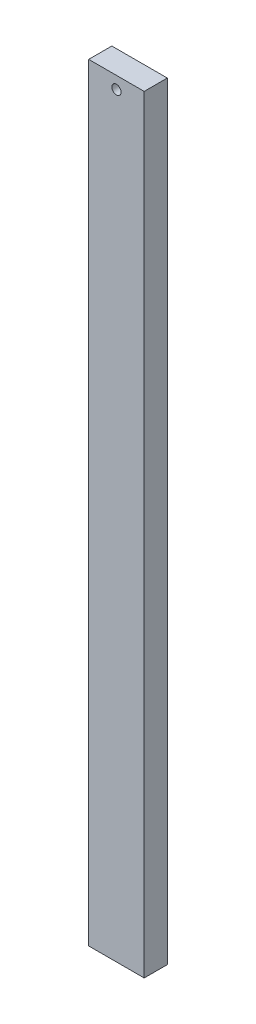
ISO-10303-21;
HEADER;
FILE_DESCRIPTION(('STEP AP214'),'2;1');
FILE_NAME('part.step','',(''),(''),'','','');
FILE_SCHEMA(('AUTOMOTIVE_DESIGN { 1 0 10303 214 1 1 1 1 }'));
ENDSEC;
DATA;
#1=APPLICATION_CONTEXT('core data for automotive mechanical design processes');
#2=APPLICATION_PROTOCOL_DEFINITION('international standard','automotive_design',2000,#1);
#3=PRODUCT_CONTEXT('',#1,'mechanical');
#4=PRODUCT('Part','Part','',(#3));
#5=PRODUCT_RELATED_PRODUCT_CATEGORY('part','',(#4));
#6=PRODUCT_DEFINITION_FORMATION('','',#4);
#7=PRODUCT_DEFINITION_CONTEXT('part definition',#1,'design');
#8=PRODUCT_DEFINITION('design','',#6,#7);
#9=PRODUCT_DEFINITION_SHAPE('','',#8);
#10=(LENGTH_UNIT() NAMED_UNIT(*) SI_UNIT(.MILLI.,.METRE.));
#11=(NAMED_UNIT(*) PLANE_ANGLE_UNIT() SI_UNIT($,.RADIAN.));
#12=(NAMED_UNIT(*) SI_UNIT($,.STERADIAN.) SOLID_ANGLE_UNIT());
#13=UNCERTAINTY_MEASURE_WITH_UNIT(LENGTH_MEASURE(1.E-05),#10,'distance_accuracy_value','');
#14=(GEOMETRIC_REPRESENTATION_CONTEXT(3) GLOBAL_UNCERTAINTY_ASSIGNED_CONTEXT((#13)) GLOBAL_UNIT_ASSIGNED_CONTEXT((#10,
#11,#12)) REPRESENTATION_CONTEXT('',''));
#15=CARTESIAN_POINT('',(0.,0.,0.));
#16=DIRECTION('',(0.,0.,1.));
#17=DIRECTION('',(1.,0.,0.));
#18=AXIS2_PLACEMENT_3D('',#15,#16,#17);
#19=CARTESIAN_POINT('',(18.,498.33,-7.5));
#20=DIRECTION('',(-1.,0.,0.));
#21=DIRECTION('',(0.,0.,1.));
#22=AXIS2_PLACEMENT_3D('',#19,#20,#21);
#23=PLANE('',#22);
#24=DIRECTION('',(0.,0.,-1.));
#25=VECTOR('',#24,1.);
#26=CARTESIAN_POINT('',(18.,0.,-7.5));
#27=LINE('',#26,#25);
#28=CARTESIAN_POINT('',(18.,0.,7.5));
#29=VERTEX_POINT('',#28);
#30=CARTESIAN_POINT('',(18.,0.,-7.5));
#31=VERTEX_POINT('',#30);
#32=EDGE_CURVE('E107',#29,#31,#27,.T.);
#33=ORIENTED_EDGE('',*,*,#32,.T.);
#34=DIRECTION('',(0.,-1.,0.));
#35=VECTOR('',#34,1.);
#36=CARTESIAN_POINT('',(18.,498.33,-7.5));
#37=LINE('',#36,#35);
#38=CARTESIAN_POINT('',(18.,498.33,-7.5));
#39=VERTEX_POINT('',#38);
#40=EDGE_CURVE('E11',#39,#31,#37,.T.);
#41=ORIENTED_EDGE('',*,*,#40,.F.);
#42=DIRECTION('',(0.,0.,-1.));
#43=VECTOR('',#42,1.);
#44=CARTESIAN_POINT('',(18.,498.33,-7.5));
#45=LINE('',#44,#43);
#46=CARTESIAN_POINT('',(18.,498.33,7.5));
#47=VERTEX_POINT('',#46);
#48=EDGE_CURVE('E91',#47,#39,#45,.T.);
#49=ORIENTED_EDGE('',*,*,#48,.F.);
#50=DIRECTION('',(0.,-1.,0.));
#51=VECTOR('',#50,1.);
#52=CARTESIAN_POINT('',(18.,498.33,7.5));
#53=LINE('',#52,#51);
#54=EDGE_CURVE('E103',#47,#29,#53,.T.);
#55=ORIENTED_EDGE('',*,*,#54,.T.);
#56=EDGE_LOOP('',(#33,#41,#49,#55));
#57=FACE_BOUND('',#56,.T.);
#58=ADVANCED_FACE('F39',(#57),#23,.F.);
#59=CARTESIAN_POINT('',(-18.,498.33,-7.5));
#60=DIRECTION('',(0.,0.,1.));
#61=DIRECTION('',(1.,0.,0.));
#62=AXIS2_PLACEMENT_3D('',#59,#60,#61);
#63=PLANE('',#62);
#64=CARTESIAN_POINT('',(0.,490.33,-7.5));
#65=DIRECTION('',(0.,0.,1.));
#66=DIRECTION('',(1.,0.,0.));
#67=AXIS2_PLACEMENT_3D('',#64,#65,#66);
#68=CIRCLE('',#67,3.);
#69=CARTESIAN_POINT('',(3.,490.33,-7.5));
#70=VERTEX_POINT('',#69);
#71=EDGE_CURVE('E111',#70,#70,#68,.T.);
#72=ORIENTED_EDGE('',*,*,#71,.T.);
#73=EDGE_LOOP('',(#72));
#74=FACE_BOUND('',#73,.T.);
#75=DIRECTION('',(-1.,0.,0.));
#76=VECTOR('',#75,1.);
#77=CARTESIAN_POINT('',(-18.,0.,-7.5));
#78=LINE('',#77,#76);
#79=CARTESIAN_POINT('',(-18.,0.,-7.5));
#80=VERTEX_POINT('',#79);
#81=EDGE_CURVE('E96',#31,#80,#78,.T.);
#82=ORIENTED_EDGE('',*,*,#81,.T.);
#83=DIRECTION('',(0.,-1.,0.));
#84=VECTOR('',#83,1.);
#85=CARTESIAN_POINT('',(-18.,498.33,-7.5));
#86=LINE('',#85,#84);
#87=CARTESIAN_POINT('',(-18.,498.33,-7.5));
#88=VERTEX_POINT('',#87);
#89=EDGE_CURVE('E48',#88,#80,#86,.T.);
#90=ORIENTED_EDGE('',*,*,#89,.F.);
#91=DIRECTION('',(-1.,0.,0.));
#92=VECTOR('',#91,1.);
#93=CARTESIAN_POINT('',(-18.,498.33,-7.5));
#94=LINE('',#93,#92);
#95=EDGE_CURVE('E86',#39,#88,#94,.T.);
#96=ORIENTED_EDGE('',*,*,#95,.F.);
#97=ORIENTED_EDGE('',*,*,#40,.T.);
#98=EDGE_LOOP('',(#82,#90,#96,#97));
#99=FACE_BOUND('',#98,.T.);
#100=ADVANCED_FACE('F95',(#74,#99),#63,.F.);
#101=CARTESIAN_POINT('',(-18.,498.33,-7.5));
#102=DIRECTION('',(1.,0.,0.));
#103=DIRECTION('',(0.,0.,-1.));
#104=AXIS2_PLACEMENT_3D('',#101,#102,#103);
#105=PLANE('',#104);
#106=DIRECTION('',(0.,0.,1.));
#107=VECTOR('',#106,1.);
#108=CARTESIAN_POINT('',(-18.,0.,-7.5));
#109=LINE('',#108,#107);
#110=CARTESIAN_POINT('',(-18.,0.,7.5));
#111=VERTEX_POINT('',#110);
#112=EDGE_CURVE('E73',#80,#111,#109,.T.);
#113=ORIENTED_EDGE('',*,*,#112,.T.);
#114=DIRECTION('',(0.,-1.,0.));
#115=VECTOR('',#114,1.);
#116=CARTESIAN_POINT('',(-18.,498.33,7.5));
#117=LINE('',#116,#115);
#118=CARTESIAN_POINT('',(-18.,498.33,7.5));
#119=VERTEX_POINT('',#118);
#120=EDGE_CURVE('E98',#119,#111,#117,.T.);
#121=ORIENTED_EDGE('',*,*,#120,.F.);
#122=DIRECTION('',(0.,0.,1.));
#123=VECTOR('',#122,1.);
#124=CARTESIAN_POINT('',(-18.,498.33,-7.5));
#125=LINE('',#124,#123);
#126=EDGE_CURVE('E89',#88,#119,#125,.T.);
#127=ORIENTED_EDGE('',*,*,#126,.F.);
#128=ORIENTED_EDGE('',*,*,#89,.T.);
#129=EDGE_LOOP('',(#113,#121,#127,#128));
#130=FACE_BOUND('',#129,.T.);
#131=ADVANCED_FACE('F99',(#130),#105,.F.);
#132=CARTESIAN_POINT('',(-18.,498.33,7.5));
#133=DIRECTION('',(0.,0.,-1.));
#134=DIRECTION('',(-1.,0.,0.));
#135=AXIS2_PLACEMENT_3D('',#132,#133,#134);
#136=PLANE('',#135);
#137=CARTESIAN_POINT('',(0.,490.33,7.5));
#138=DIRECTION('',(0.,0.,1.));
#139=DIRECTION('',(1.,0.,0.));
#140=AXIS2_PLACEMENT_3D('',#137,#138,#139);
#141=CIRCLE('',#140,3.);
#142=CARTESIAN_POINT('',(3.,490.33,7.5));
#143=VERTEX_POINT('',#142);
#144=EDGE_CURVE('E128',#143,#143,#141,.T.);
#145=ORIENTED_EDGE('',*,*,#144,.F.);
#146=EDGE_LOOP('',(#145));
#147=FACE_BOUND('',#146,.T.);
#148=DIRECTION('',(1.,0.,0.));
#149=VECTOR('',#148,1.);
#150=CARTESIAN_POINT('',(-18.,0.,7.5));
#151=LINE('',#150,#149);
#152=EDGE_CURVE('E79',#111,#29,#151,.T.);
#153=ORIENTED_EDGE('',*,*,#152,.T.);
#154=ORIENTED_EDGE('',*,*,#54,.F.);
#155=DIRECTION('',(1.,0.,0.));
#156=VECTOR('',#155,1.);
#157=CARTESIAN_POINT('',(-18.,498.33,7.5));
#158=LINE('',#157,#156);
#159=EDGE_CURVE('E56',#119,#47,#158,.T.);
#160=ORIENTED_EDGE('',*,*,#159,.F.);
#161=ORIENTED_EDGE('',*,*,#120,.T.);
#162=EDGE_LOOP('',(#153,#154,#160,#161));
#163=FACE_BOUND('',#162,.T.);
#164=ADVANCED_FACE('F121',(#147,#163),#136,.F.);
#165=CARTESIAN_POINT('',(0.,498.33,0.));
#166=DIRECTION('',(0.,1.,0.));
#167=DIRECTION('',(0.,0.,1.));
#168=AXIS2_PLACEMENT_3D('',#165,#166,#167);
#169=PLANE('',#168);
#170=ORIENTED_EDGE('',*,*,#48,.T.);
#171=ORIENTED_EDGE('',*,*,#95,.T.);
#172=ORIENTED_EDGE('',*,*,#126,.T.);
#173=ORIENTED_EDGE('',*,*,#159,.T.);
#174=EDGE_LOOP('',(#170,#171,#172,#173));
#175=FACE_BOUND('',#174,.T.);
#176=ADVANCED_FACE('F87',(#175),#169,.T.);
#177=CARTESIAN_POINT('',(0.,0.,0.));
#178=DIRECTION('',(0.,1.,0.));
#179=DIRECTION('',(0.,0.,1.));
#180=AXIS2_PLACEMENT_3D('',#177,#178,#179);
#181=PLANE('',#180);
#182=ORIENTED_EDGE('',*,*,#32,.F.);
#183=ORIENTED_EDGE('',*,*,#152,.F.);
#184=ORIENTED_EDGE('',*,*,#112,.F.);
#185=ORIENTED_EDGE('',*,*,#81,.F.);
#186=EDGE_LOOP('',(#182,#183,#184,#185));
#187=FACE_BOUND('',#186,.T.);
#188=ADVANCED_FACE('F124',(#187),#181,.F.);
#189=CARTESIAN_POINT('',(0.,490.33,-7.5));
#190=DIRECTION('',(0.,0.,1.));
#191=DIRECTION('',(1.,0.,0.));
#192=AXIS2_PLACEMENT_3D('',#189,#190,#191);
#193=CYLINDRICAL_SURFACE('',#192,3.);
#194=ORIENTED_EDGE('',*,*,#71,.F.);
#195=EDGE_LOOP('',(#194));
#196=FACE_BOUND('',#195,.T.);
#197=ORIENTED_EDGE('',*,*,#144,.T.);
#198=EDGE_LOOP('',(#197));
#199=FACE_BOUND('',#198,.T.);
#200=ADVANCED_FACE('F137',(#196,#199),#193,.F.);
#201=CLOSED_SHELL('',(#58,#100,#131,#164,#176,#188,#200));
#202=MANIFOLD_SOLID_BREP('B2',#201);
#203=ADVANCED_BREP_SHAPE_REPRESENTATION('',(#18,#202),#14);
#204=SHAPE_DEFINITION_REPRESENTATION(#9,#203);
ENDSEC;
END-ISO-10303-21;
